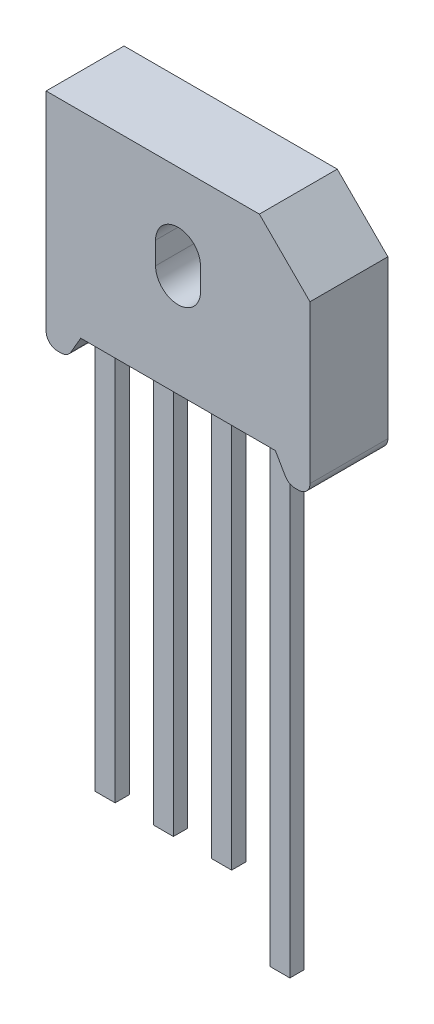
ISO-10303-21;
HEADER;
FILE_DESCRIPTION(('STEP AP214'),'2;1');
FILE_NAME('part.step','',(''),(''),'','','');
FILE_SCHEMA(('AUTOMOTIVE_DESIGN { 1 0 10303 214 1 1 1 1 }'));
ENDSEC;
DATA;
#1=APPLICATION_CONTEXT('core data for automotive mechanical design processes');
#2=APPLICATION_PROTOCOL_DEFINITION('international standard','automotive_design',2000,#1);
#3=PRODUCT_CONTEXT('',#1,'mechanical');
#4=PRODUCT('Part','Part','',(#3));
#5=PRODUCT_RELATED_PRODUCT_CATEGORY('part','',(#4));
#6=PRODUCT_DEFINITION_FORMATION('','',#4);
#7=PRODUCT_DEFINITION_CONTEXT('part definition',#1,'design');
#8=PRODUCT_DEFINITION('design','',#6,#7);
#9=PRODUCT_DEFINITION_SHAPE('','',#8);
#10=(LENGTH_UNIT() NAMED_UNIT(*) SI_UNIT(.MILLI.,.METRE.));
#11=(NAMED_UNIT(*) PLANE_ANGLE_UNIT() SI_UNIT($,.RADIAN.));
#12=(NAMED_UNIT(*) SI_UNIT($,.STERADIAN.) SOLID_ANGLE_UNIT());
#13=UNCERTAINTY_MEASURE_WITH_UNIT(LENGTH_MEASURE(1.E-05),#10,'distance_accuracy_value','');
#14=(GEOMETRIC_REPRESENTATION_CONTEXT(3) GLOBAL_UNCERTAINTY_ASSIGNED_CONTEXT((#13)) GLOBAL_UNIT_ASSIGNED_CONTEXT((#10,
#11,#12)) REPRESENTATION_CONTEXT('',''));
#15=CARTESIAN_POINT('',(0.,0.,0.));
#16=DIRECTION('',(0.,0.,1.));
#17=DIRECTION('',(1.,0.,0.));
#18=AXIS2_PLACEMENT_3D('',#15,#16,#17);
#19=CARTESIAN_POINT('',(0.,-2.89906260184823,3.425));
#20=DIRECTION('',(0.,1.,0.));
#21=DIRECTION('',(-1.,0.,0.));
#22=AXIS2_PLACEMENT_3D('',#19,#20,#21);
#23=PLANE('',#22);
#24=DIRECTION('',(-1.,0.,0.));
#25=VECTOR('',#24,1.);
#26=CARTESIAN_POINT('',(1.68627106179795,-2.89906260184823,2.15));
#27=LINE('',#26,#25);
#28=CARTESIAN_POINT('',(3.43627106179795,-2.89906260184823,2.15));
#29=VERTEX_POINT('',#28);
#30=CARTESIAN_POINT('',(1.68627106179795,-2.89906260184823,2.15));
#31=VERTEX_POINT('',#30);
#32=EDGE_CURVE('E315',#29,#31,#27,.T.);
#33=ORIENTED_EDGE('',*,*,#32,.F.);
#34=DIRECTION('',(0.,0.,1.));
#35=VECTOR('',#34,1.);
#36=CARTESIAN_POINT('',(3.43627106179795,-2.89906260184823,0.900000000000001));
#37=LINE('',#36,#35);
#38=CARTESIAN_POINT('',(3.43627106179795,-2.89906260184823,0.900000000000001));
#39=VERTEX_POINT('',#38);
#40=EDGE_CURVE('E321',#39,#29,#37,.T.);
#41=ORIENTED_EDGE('',*,*,#40,.F.);
#42=DIRECTION('',(1.,0.,0.));
#43=VECTOR('',#42,1.);
#44=CARTESIAN_POINT('',(1.68627106179795,-2.89906260184823,0.900000000000001));
#45=LINE('',#44,#43);
#46=CARTESIAN_POINT('',(1.68627106179789,-2.89906260184823,0.900000000000001));
#47=VERTEX_POINT('',#46);
#48=EDGE_CURVE('E336',#47,#39,#45,.T.);
#49=ORIENTED_EDGE('',*,*,#48,.F.);
#50=DIRECTION('',(0.,0.,-1.));
#51=VECTOR('',#50,1.);
#52=CARTESIAN_POINT('',(1.68627106179795,-2.89906260184823,0.900000000000001));
#53=LINE('',#52,#51);
#54=EDGE_CURVE('E71',#31,#47,#53,.T.);
#55=ORIENTED_EDGE('',*,*,#54,.F.);
#56=EDGE_LOOP('',(#33,#41,#49,#55));
#57=FACE_BOUND('',#56,.T.);
#58=DIRECTION('',(-1.,0.,0.));
#59=VECTOR('',#58,1.);
#60=CARTESIAN_POINT('',(-3.43627106179791,-2.89906260184822,2.15));
#61=LINE('',#60,#59);
#62=CARTESIAN_POINT('',(-1.68627106179791,-2.89906260184822,2.15));
#63=VERTEX_POINT('',#62);
#64=CARTESIAN_POINT('',(-3.43627106179791,-2.89906260184822,2.15));
#65=VERTEX_POINT('',#64);
#66=EDGE_CURVE('E357',#63,#65,#61,.T.);
#67=ORIENTED_EDGE('',*,*,#66,.F.);
#68=DIRECTION('',(0.,0.,1.));
#69=VECTOR('',#68,1.);
#70=CARTESIAN_POINT('',(-1.68627106179791,-2.89906260184822,0.900000000000001));
#71=LINE('',#70,#69);
#72=CARTESIAN_POINT('',(-1.68627106179791,-2.89906260184822,0.900000000000001));
#73=VERTEX_POINT('',#72);
#74=EDGE_CURVE('E363',#73,#63,#71,.T.);
#75=ORIENTED_EDGE('',*,*,#74,.F.);
#76=DIRECTION('',(1.,0.,0.));
#77=VECTOR('',#76,1.);
#78=CARTESIAN_POINT('',(-3.43627106179791,-2.89906260184822,0.900000000000001));
#79=LINE('',#78,#77);
#80=CARTESIAN_POINT('',(-3.43627106179797,-2.89906260184822,0.900000000000001));
#81=VERTEX_POINT('',#80);
#82=EDGE_CURVE('E379',#81,#73,#79,.T.);
#83=ORIENTED_EDGE('',*,*,#82,.F.);
#84=DIRECTION('',(0.,0.,-1.));
#85=VECTOR('',#84,1.);
#86=CARTESIAN_POINT('',(-3.43627106179791,-2.89906260184822,0.900000000000001));
#87=LINE('',#86,#85);
#88=EDGE_CURVE('E375',#65,#81,#87,.T.);
#89=ORIENTED_EDGE('',*,*,#88,.F.);
#90=EDGE_LOOP('',(#67,#75,#83,#89));
#91=FACE_BOUND('',#90,.T.);
#92=DIRECTION('',(-1.,0.,0.));
#93=VECTOR('',#92,1.);
#94=CARTESIAN_POINT('',(6.8088131853938,-2.89906260184824,2.15));
#95=LINE('',#94,#93);
#96=CARTESIAN_POINT('',(8.5588131853938,-2.89906260184824,2.15));
#97=VERTEX_POINT('',#96);
#98=CARTESIAN_POINT('',(6.8088131853938,-2.89906260184824,2.15));
#99=VERTEX_POINT('',#98);
#100=EDGE_CURVE('E296',#97,#99,#95,.T.);
#101=ORIENTED_EDGE('',*,*,#100,.F.);
#102=DIRECTION('',(0.,0.,-1.));
#103=VECTOR('',#102,1.);
#104=CARTESIAN_POINT('',(8.5588131853938,-2.89906260184824,3.425));
#105=LINE('',#104,#103);
#106=CARTESIAN_POINT('',(8.5588131853938,-2.89906260184824,3.425));
#107=VERTEX_POINT('',#106);
#108=EDGE_CURVE('E590',#107,#97,#105,.T.);
#109=ORIENTED_EDGE('',*,*,#108,.F.);
#110=DIRECTION('',(1.,0.,0.));
#111=VECTOR('',#110,1.);
#112=CARTESIAN_POINT('',(0.,-2.89906260184823,3.425));
#113=LINE('',#112,#111);
#114=CARTESIAN_POINT('',(-8.55881318539377,-2.89906260184821,3.425));
#115=VERTEX_POINT('',#114);
#116=EDGE_CURVE('E480',#115,#107,#113,.T.);
#117=ORIENTED_EDGE('',*,*,#116,.F.);
#118=DIRECTION('',(0.,0.,-1.));
#119=VECTOR('',#118,1.);
#120=CARTESIAN_POINT('',(-8.55881318539377,-2.89906260184821,3.425));
#121=LINE('',#120,#119);
#122=CARTESIAN_POINT('',(-8.55881318539377,-2.89906260184821,2.15));
#123=VERTEX_POINT('',#122);
#124=EDGE_CURVE('E595',#115,#123,#121,.T.);
#125=ORIENTED_EDGE('',*,*,#124,.T.);
#126=DIRECTION('',(-1.,0.,0.));
#127=VECTOR('',#126,1.);
#128=CARTESIAN_POINT('',(-8.55881318539377,-2.89906260184821,2.15));
#129=LINE('',#128,#127);
#130=CARTESIAN_POINT('',(-6.80881318539377,-2.89906260184822,2.15));
#131=VERTEX_POINT('',#130);
#132=EDGE_CURVE('E420',#131,#123,#129,.T.);
#133=ORIENTED_EDGE('',*,*,#132,.F.);
#134=DIRECTION('',(0.,0.,1.));
#135=VECTOR('',#134,1.);
#136=CARTESIAN_POINT('',(-6.80881318539377,-2.89906260184822,0.900000000000001));
#137=LINE('',#136,#135);
#138=CARTESIAN_POINT('',(-6.80881318539377,-2.89906260184822,0.900000000000001));
#139=VERTEX_POINT('',#138);
#140=EDGE_CURVE('E401',#139,#131,#137,.T.);
#141=ORIENTED_EDGE('',*,*,#140,.F.);
#142=DIRECTION('',(1.,0.,0.));
#143=VECTOR('',#142,1.);
#144=CARTESIAN_POINT('',(-8.55881318539377,-2.89906260184821,0.900000000000001));
#145=LINE('',#144,#143);
#146=CARTESIAN_POINT('',(-8.55881318539377,-2.89906260184821,0.900000000000002));
#147=VERTEX_POINT('',#146);
#148=EDGE_CURVE('E407',#147,#139,#145,.T.);
#149=ORIENTED_EDGE('',*,*,#148,.F.);
#150=CARTESIAN_POINT('',(-8.55881318539377,-2.89906260184821,-3.425));
#151=VERTEX_POINT('',#150);
#152=EDGE_CURVE('E594',#147,#151,#121,.T.);
#153=ORIENTED_EDGE('',*,*,#152,.T.);
#154=DIRECTION('',(1.,0.,0.));
#155=VECTOR('',#154,1.);
#156=CARTESIAN_POINT('',(0.,-2.89906260184823,-3.425));
#157=LINE('',#156,#155);
#158=CARTESIAN_POINT('',(8.5588131853938,-2.89906260184824,-3.425));
#159=VERTEX_POINT('',#158);
#160=EDGE_CURVE('E543',#151,#159,#157,.T.);
#161=ORIENTED_EDGE('',*,*,#160,.T.);
#162=CARTESIAN_POINT('',(8.5588131853938,-2.89906260184824,0.900000000000002));
#163=VERTEX_POINT('',#162);
#164=EDGE_CURVE('E589',#163,#159,#105,.T.);
#165=ORIENTED_EDGE('',*,*,#164,.F.);
#166=DIRECTION('',(1.,0.,0.));
#167=VECTOR('',#166,1.);
#168=CARTESIAN_POINT('',(6.8088131853938,-2.89906260184824,0.900000000000001));
#169=LINE('',#168,#167);
#170=CARTESIAN_POINT('',(6.8088131853938,-2.89906260184824,0.900000000000001));
#171=VERTEX_POINT('',#170);
#172=EDGE_CURVE('E302',#171,#163,#169,.T.);
#173=ORIENTED_EDGE('',*,*,#172,.F.);
#174=DIRECTION('',(0.,0.,-1.));
#175=VECTOR('',#174,1.);
#176=CARTESIAN_POINT('',(6.8088131853938,-2.89906260184824,0.900000000000001));
#177=LINE('',#176,#175);
#178=EDGE_CURVE('E299',#99,#171,#177,.T.);
#179=ORIENTED_EDGE('',*,*,#178,.F.);
#180=EDGE_LOOP('',(#101,#109,#117,#125,#133,#141,#149,#153,#161,#165,#173,#179));
#181=FACE_BOUND('',#180,.T.);
#182=ADVANCED_FACE('F45',(#57,#91,#181),#23,.F.);
#183=CARTESIAN_POINT('',(0.,5.90391050292713,3.425));
#184=DIRECTION('',(0.,0.,-1.));
#185=DIRECTION('',(-1.,0.,0.));
#186=AXIS2_PLACEMENT_3D('',#183,#184,#185);
#187=CYLINDRICAL_SURFACE('',#186,1.975);
#188=CARTESIAN_POINT('',(0.,5.90391050292713,-3.425));
#189=DIRECTION('',(0.,0.,1.));
#190=DIRECTION('',(1.,0.,0.));
#191=AXIS2_PLACEMENT_3D('',#188,#189,#190);
#192=CIRCLE('',#191,1.975);
#193=CARTESIAN_POINT('',(-1.975,5.90391050292713,-3.425));
#194=VERTEX_POINT('',#193);
#195=CARTESIAN_POINT('',(1.97500000000001,5.90391050292713,-3.425));
#196=VERTEX_POINT('',#195);
#197=EDGE_CURVE('E559',#194,#196,#192,.T.);
#198=ORIENTED_EDGE('',*,*,#197,.F.);
#199=DIRECTION('',(0.,0.,-1.));
#200=VECTOR('',#199,1.);
#201=CARTESIAN_POINT('',(-1.975,5.90391050292713,3.425));
#202=LINE('',#201,#200);
#203=CARTESIAN_POINT('',(-1.975,5.90391050292713,3.425));
#204=VERTEX_POINT('',#203);
#205=EDGE_CURVE('E11',#204,#194,#202,.T.);
#206=ORIENTED_EDGE('',*,*,#205,.F.);
#207=CARTESIAN_POINT('',(0.,5.90391050292713,3.425));
#208=DIRECTION('',(0.,0.,1.));
#209=DIRECTION('',(1.,0.,0.));
#210=AXIS2_PLACEMENT_3D('',#207,#208,#209);
#211=CIRCLE('',#210,1.975);
#212=CARTESIAN_POINT('',(1.97500000000001,5.90391050292713,3.425));
#213=VERTEX_POINT('',#212);
#214=EDGE_CURVE('E494',#204,#213,#211,.T.);
#215=ORIENTED_EDGE('',*,*,#214,.T.);
#216=DIRECTION('',(0.,0.,-1.));
#217=VECTOR('',#216,1.);
#218=CARTESIAN_POINT('',(1.97500000000001,5.90391050292713,3.425));
#219=LINE('',#218,#217);
#220=EDGE_CURVE('E574',#213,#196,#219,.T.);
#221=ORIENTED_EDGE('',*,*,#220,.T.);
#222=EDGE_LOOP('',(#198,#206,#215,#221));
#223=FACE_BOUND('',#222,.T.);
#224=ADVANCED_FACE('F718',(#223),#187,.F.);
#225=CARTESIAN_POINT('',(-1.975,0.,3.425));
#226=DIRECTION('',(1.,0.,0.));
#227=DIRECTION('',(0.,1.,0.));
#228=AXIS2_PLACEMENT_3D('',#225,#226,#227);
#229=PLANE('',#228);
#230=DIRECTION('',(0.,-1.,0.));
#231=VECTOR('',#230,1.);
#232=CARTESIAN_POINT('',(-1.975,0.,-3.425));
#233=LINE('',#232,#231);
#234=CARTESIAN_POINT('',(-1.975,7.85391050292713,-3.425));
#235=VERTEX_POINT('',#234);
#236=EDGE_CURVE('E563',#235,#194,#233,.T.);
#237=ORIENTED_EDGE('',*,*,#236,.F.);
#238=DIRECTION('',(0.,0.,-1.));
#239=VECTOR('',#238,1.);
#240=CARTESIAN_POINT('',(-1.975,7.85391050292713,3.425));
#241=LINE('',#240,#239);
#242=CARTESIAN_POINT('',(-1.975,7.85391050292713,3.425));
#243=VERTEX_POINT('',#242);
#244=EDGE_CURVE('E55',#243,#235,#241,.T.);
#245=ORIENTED_EDGE('',*,*,#244,.F.);
#246=DIRECTION('',(0.,-1.,0.));
#247=VECTOR('',#246,1.);
#248=CARTESIAN_POINT('',(-1.975,0.,3.425));
#249=LINE('',#248,#247);
#250=EDGE_CURVE('E498',#243,#204,#249,.T.);
#251=ORIENTED_EDGE('',*,*,#250,.T.);
#252=ORIENTED_EDGE('',*,*,#205,.T.);
#253=EDGE_LOOP('',(#237,#245,#251,#252));
#254=FACE_BOUND('',#253,.T.);
#255=ADVANCED_FACE('F723',(#254),#229,.T.);
#256=CARTESIAN_POINT('',(0.,7.85391050292713,3.425));
#257=DIRECTION('',(0.,0.,-1.));
#258=DIRECTION('',(-1.,0.,0.));
#259=AXIS2_PLACEMENT_3D('',#256,#257,#258);
#260=CYLINDRICAL_SURFACE('',#259,1.975);
#261=CARTESIAN_POINT('',(0.,7.85391050292713,-3.425));
#262=DIRECTION('',(0.,0.,1.));
#263=DIRECTION('',(1.,0.,0.));
#264=AXIS2_PLACEMENT_3D('',#261,#262,#263);
#265=CIRCLE('',#264,1.975);
#266=CARTESIAN_POINT('',(1.97500000000001,7.85391050292713,-3.425));
#267=VERTEX_POINT('',#266);
#268=EDGE_CURVE('E567',#267,#235,#265,.T.);
#269=ORIENTED_EDGE('',*,*,#268,.F.);
#270=DIRECTION('',(0.,0.,-1.));
#271=VECTOR('',#270,1.);
#272=CARTESIAN_POINT('',(1.97500000000001,7.85391050292713,3.425));
#273=LINE('',#272,#271);
#274=CARTESIAN_POINT('',(1.97500000000001,7.85391050292713,3.425));
#275=VERTEX_POINT('',#274);
#276=EDGE_CURVE('E576',#275,#267,#273,.T.);
#277=ORIENTED_EDGE('',*,*,#276,.F.);
#278=CARTESIAN_POINT('',(0.,7.85391050292713,3.425));
#279=DIRECTION('',(0.,0.,1.));
#280=DIRECTION('',(1.,0.,0.));
#281=AXIS2_PLACEMENT_3D('',#278,#279,#280);
#282=CIRCLE('',#281,1.975);
#283=EDGE_CURVE('E502',#275,#243,#282,.T.);
#284=ORIENTED_EDGE('',*,*,#283,.T.);
#285=ORIENTED_EDGE('',*,*,#244,.T.);
#286=EDGE_LOOP('',(#269,#277,#284,#285));
#287=FACE_BOUND('',#286,.T.);
#288=ADVANCED_FACE('F747',(#287),#260,.F.);
#289=CARTESIAN_POINT('',(10.6,-3.89608949707287,3.425));
#290=DIRECTION('',(0.,0.,-1.));
#291=DIRECTION('',(-1.,0.,0.));
#292=AXIS2_PLACEMENT_3D('',#289,#290,#291);
#293=CYLINDRICAL_SURFACE('',#292,1.);
#294=CARTESIAN_POINT('',(10.6,-3.89608949707287,-3.425));
#295=DIRECTION('',(0.,0.,1.));
#296=DIRECTION('',(1.,0.,0.));
#297=AXIS2_PLACEMENT_3D('',#294,#295,#296);
#298=CIRCLE('',#297,1.);
#299=CARTESIAN_POINT('',(11.6,-3.89608949707286,-3.425));
#300=VERTEX_POINT('',#299);
#301=CARTESIAN_POINT('',(10.6,-4.89608949707287,-3.425));
#302=VERTEX_POINT('',#301);
#303=EDGE_CURVE('E446',#300,#302,#298,.F.);
#304=ORIENTED_EDGE('',*,*,#303,.F.);
#305=DIRECTION('',(0.,0.,-1.));
#306=VECTOR('',#305,1.);
#307=CARTESIAN_POINT('',(11.6,-3.89608949707286,3.425));
#308=LINE('',#307,#306);
#309=CARTESIAN_POINT('',(11.6,-3.89608949707286,3.425));
#310=VERTEX_POINT('',#309);
#311=EDGE_CURVE('E49',#310,#300,#308,.T.);
#312=ORIENTED_EDGE('',*,*,#311,.F.);
#313=CARTESIAN_POINT('',(10.6,-3.89608949707287,3.425));
#314=DIRECTION('',(0.,0.,1.));
#315=DIRECTION('',(1.,0.,0.));
#316=AXIS2_PLACEMENT_3D('',#313,#314,#315);
#317=CIRCLE('',#316,1.);
#318=CARTESIAN_POINT('',(10.6,-4.89608949707287,3.425));
#319=VERTEX_POINT('',#318);
#320=EDGE_CURVE('E447',#310,#319,#317,.F.);
#321=ORIENTED_EDGE('',*,*,#320,.T.);
#322=DIRECTION('',(0.,0.,-1.));
#323=VECTOR('',#322,1.);
#324=CARTESIAN_POINT('',(10.6,-4.89608949707287,3.425));
#325=LINE('',#324,#323);
#326=EDGE_CURVE('E509',#319,#302,#325,.T.);
#327=ORIENTED_EDGE('',*,*,#326,.T.);
#328=EDGE_LOOP('',(#304,#312,#321,#327));
#329=FACE_BOUND('',#328,.T.);
#330=ADVANCED_FACE('F47',(#329),#293,.T.);
#331=CARTESIAN_POINT('',(11.6,0.,3.425));
#332=DIRECTION('',(1.,0.,0.));
#333=DIRECTION('',(0.,0.,-1.));
#334=AXIS2_PLACEMENT_3D('',#331,#332,#333);
#335=PLANE('',#334);
#336=DIRECTION('',(0.,-1.,0.));
#337=VECTOR('',#336,1.);
#338=CARTESIAN_POINT('',(11.6,0.,-3.425));
#339=LINE('',#338,#337);
#340=CARTESIAN_POINT('',(11.6,9.95391050292714,-3.425));
#341=VERTEX_POINT('',#340);
#342=EDGE_CURVE('E513',#341,#300,#339,.T.);
#343=ORIENTED_EDGE('',*,*,#342,.F.);
#344=DIRECTION('',(0.,0.,-1.));
#345=VECTOR('',#344,1.);
#346=CARTESIAN_POINT('',(11.6,9.95391050292714,3.425));
#347=LINE('',#346,#345);
#348=CARTESIAN_POINT('',(11.6,9.95391050292714,3.425));
#349=VERTEX_POINT('',#348);
#350=EDGE_CURVE('E618',#349,#341,#347,.T.);
#351=ORIENTED_EDGE('',*,*,#350,.F.);
#352=DIRECTION('',(0.,-1.,0.));
#353=VECTOR('',#352,1.);
#354=CARTESIAN_POINT('',(11.6,0.,3.425));
#355=LINE('',#354,#353);
#356=EDGE_CURVE('E451',#349,#310,#355,.T.);
#357=ORIENTED_EDGE('',*,*,#356,.T.);
#358=ORIENTED_EDGE('',*,*,#311,.T.);
#359=EDGE_LOOP('',(#343,#351,#357,#358));
#360=FACE_BOUND('',#359,.T.);
#361=ADVANCED_FACE('F628',(#360),#335,.T.);
#362=CARTESIAN_POINT('',(10.7769552514636,10.7769552514636,3.425));
#363=DIRECTION('',(0.707106781186546,0.707106781186549,0.));
#364=DIRECTION('',(-0.707106781186549,0.707106781186546,0.));
#365=AXIS2_PLACEMENT_3D('',#362,#363,#364);
#366=PLANE('',#365);
#367=DIRECTION('',(0.707106781186549,-0.707106781186546,0.));
#368=VECTOR('',#367,1.);
#369=CARTESIAN_POINT('',(10.7769552514636,10.7769552514636,-3.425));
#370=LINE('',#369,#368);
#371=CARTESIAN_POINT('',(7.15,14.4039105029271,-3.425));
#372=VERTEX_POINT('',#371);
#373=EDGE_CURVE('E517',#372,#341,#370,.T.);
#374=ORIENTED_EDGE('',*,*,#373,.F.);
#375=DIRECTION('',(0.,0.,-1.));
#376=VECTOR('',#375,1.);
#377=CARTESIAN_POINT('',(7.15,14.4039105029271,3.425));
#378=LINE('',#377,#376);
#379=CARTESIAN_POINT('',(7.15,14.4039105029271,3.425));
#380=VERTEX_POINT('',#379);
#381=EDGE_CURVE('E616',#380,#372,#378,.T.);
#382=ORIENTED_EDGE('',*,*,#381,.F.);
#383=DIRECTION('',(0.707106781186549,-0.707106781186546,0.));
#384=VECTOR('',#383,1.);
#385=CARTESIAN_POINT('',(10.7769552514636,10.7769552514636,3.425));
#386=LINE('',#385,#384);
#387=EDGE_CURVE('E456',#380,#349,#386,.T.);
#388=ORIENTED_EDGE('',*,*,#387,.T.);
#389=ORIENTED_EDGE('',*,*,#350,.T.);
#390=EDGE_LOOP('',(#374,#382,#388,#389));
#391=FACE_BOUND('',#390,.T.);
#392=ADVANCED_FACE('F638',(#391),#366,.T.);
#393=CARTESIAN_POINT('',(0.,14.4039105029271,3.425));
#394=DIRECTION('',(0.,1.,0.));
#395=DIRECTION('',(-1.,0.,0.));
#396=AXIS2_PLACEMENT_3D('',#393,#394,#395);
#397=PLANE('',#396);
#398=DIRECTION('',(1.,0.,0.));
#399=VECTOR('',#398,1.);
#400=CARTESIAN_POINT('',(0.,14.4039105029271,-3.425));
#401=LINE('',#400,#399);
#402=CARTESIAN_POINT('',(-11.6,14.4039105029271,-3.425));
#403=VERTEX_POINT('',#402);
#404=EDGE_CURVE('E521',#403,#372,#401,.T.);
#405=ORIENTED_EDGE('',*,*,#404,.F.);
#406=DIRECTION('',(0.,0.,-1.));
#407=VECTOR('',#406,1.);
#408=CARTESIAN_POINT('',(-11.6,14.4039105029271,3.425));
#409=LINE('',#408,#407);
#410=CARTESIAN_POINT('',(-11.6,14.4039105029271,3.425));
#411=VERTEX_POINT('',#410);
#412=EDGE_CURVE('E613',#411,#403,#409,.T.);
#413=ORIENTED_EDGE('',*,*,#412,.F.);
#414=DIRECTION('',(1.,0.,0.));
#415=VECTOR('',#414,1.);
#416=CARTESIAN_POINT('',(0.,14.4039105029271,3.425));
#417=LINE('',#416,#415);
#418=EDGE_CURVE('E460',#411,#380,#417,.T.);
#419=ORIENTED_EDGE('',*,*,#418,.T.);
#420=ORIENTED_EDGE('',*,*,#381,.T.);
#421=EDGE_LOOP('',(#405,#413,#419,#420));
#422=FACE_BOUND('',#421,.T.);
#423=ADVANCED_FACE('F645',(#422),#397,.T.);
#424=CARTESIAN_POINT('',(-11.6,0.,3.425));
#425=DIRECTION('',(1.,0.,0.));
#426=DIRECTION('',(0.,0.,-1.));
#427=AXIS2_PLACEMENT_3D('',#424,#425,#426);
#428=PLANE('',#427);
#429=DIRECTION('',(0.,-1.,0.));
#430=VECTOR('',#429,1.);
#431=CARTESIAN_POINT('',(-11.6,0.,-3.425));
#432=LINE('',#431,#430);
#433=CARTESIAN_POINT('',(-11.6,-3.89608949707287,-3.425));
#434=VERTEX_POINT('',#433);
#435=EDGE_CURVE('E525',#403,#434,#432,.T.);
#436=ORIENTED_EDGE('',*,*,#435,.T.);
#437=DIRECTION('',(0.,0.,-1.));
#438=VECTOR('',#437,1.);
#439=CARTESIAN_POINT('',(-11.6,-3.89608949707287,3.425));
#440=LINE('',#439,#438);
#441=CARTESIAN_POINT('',(-11.6,-3.89608949707287,3.425));
#442=VERTEX_POINT('',#441);
#443=EDGE_CURVE('E609',#442,#434,#440,.T.);
#444=ORIENTED_EDGE('',*,*,#443,.F.);
#445=DIRECTION('',(0.,-1.,0.));
#446=VECTOR('',#445,1.);
#447=CARTESIAN_POINT('',(-11.6,0.,3.425));
#448=LINE('',#447,#446);
#449=EDGE_CURVE('E464',#411,#442,#448,.T.);
#450=ORIENTED_EDGE('',*,*,#449,.F.);
#451=ORIENTED_EDGE('',*,*,#412,.T.);
#452=EDGE_LOOP('',(#436,#444,#450,#451));
#453=FACE_BOUND('',#452,.T.);
#454=ADVANCED_FACE('F649',(#453),#428,.F.);
#455=CARTESIAN_POINT('',(-10.6,-3.89608949707287,3.425));
#456=DIRECTION('',(0.,0.,-1.));
#457=DIRECTION('',(-1.,0.,0.));
#458=AXIS2_PLACEMENT_3D('',#455,#456,#457);
#459=CYLINDRICAL_SURFACE('',#458,1.);
#460=CARTESIAN_POINT('',(-10.6,-3.89608949707287,-3.425));
#461=DIRECTION('',(0.,0.,1.));
#462=DIRECTION('',(1.,0.,0.));
#463=AXIS2_PLACEMENT_3D('',#460,#461,#462);
#464=CIRCLE('',#463,1.);
#465=CARTESIAN_POINT('',(-10.6,-4.89608949707287,-3.425));
#466=VERTEX_POINT('',#465);
#467=EDGE_CURVE('E528',#434,#466,#464,.T.);
#468=ORIENTED_EDGE('',*,*,#467,.T.);
#469=DIRECTION('',(0.,0.,-1.));
#470=VECTOR('',#469,1.);
#471=CARTESIAN_POINT('',(-10.6,-4.89608949707287,3.425));
#472=LINE('',#471,#470);
#473=CARTESIAN_POINT('',(-10.6,-4.89608949707287,3.425));
#474=VERTEX_POINT('',#473);
#475=EDGE_CURVE('E605',#474,#466,#472,.T.);
#476=ORIENTED_EDGE('',*,*,#475,.F.);
#477=CARTESIAN_POINT('',(-10.6,-3.89608949707287,3.425));
#478=DIRECTION('',(0.,0.,1.));
#479=DIRECTION('',(1.,0.,0.));
#480=AXIS2_PLACEMENT_3D('',#477,#478,#479);
#481=CIRCLE('',#480,1.);
#482=EDGE_CURVE('E467',#442,#474,#481,.T.);
#483=ORIENTED_EDGE('',*,*,#482,.F.);
#484=ORIENTED_EDGE('',*,*,#443,.T.);
#485=EDGE_LOOP('',(#468,#476,#483,#484));
#486=FACE_BOUND('',#485,.T.);
#487=ADVANCED_FACE('F656',(#486),#459,.T.);
#488=CARTESIAN_POINT('',(0.,-4.89608949707287,3.425));
#489=DIRECTION('',(0.,1.,0.));
#490=DIRECTION('',(0.,0.,1.));
#491=AXIS2_PLACEMENT_3D('',#488,#489,#490);
#492=PLANE('',#491);
#493=DIRECTION('',(1.,0.,0.));
#494=VECTOR('',#493,1.);
#495=CARTESIAN_POINT('',(0.,-4.89608949707287,-3.425));
#496=LINE('',#495,#494);
#497=CARTESIAN_POINT('',(-10.2891474701203,-4.89608949707287,-3.425));
#498=VERTEX_POINT('',#497);
#499=EDGE_CURVE('E531',#466,#498,#496,.T.);
#500=ORIENTED_EDGE('',*,*,#499,.T.);
#501=DIRECTION('',(0.,0.,-1.));
#502=VECTOR('',#501,1.);
#503=CARTESIAN_POINT('',(-10.2891474701203,-4.89608949707287,3.425));
#504=LINE('',#503,#502);
#505=CARTESIAN_POINT('',(-10.2891474701203,-4.89608949707287,3.425));
#506=VERTEX_POINT('',#505);
#507=EDGE_CURVE('E602',#506,#498,#504,.T.);
#508=ORIENTED_EDGE('',*,*,#507,.F.);
#509=DIRECTION('',(1.,0.,0.));
#510=VECTOR('',#509,1.);
#511=CARTESIAN_POINT('',(0.,-4.89608949707287,3.425));
#512=LINE('',#511,#510);
#513=EDGE_CURVE('E470',#474,#506,#512,.T.);
#514=ORIENTED_EDGE('',*,*,#513,.F.);
#515=ORIENTED_EDGE('',*,*,#475,.T.);
#516=EDGE_LOOP('',(#500,#508,#514,#515));
#517=FACE_BOUND('',#516,.T.);
#518=ADVANCED_FACE('F660',(#517),#492,.F.);
#519=CARTESIAN_POINT('',(-10.2891474701203,-3.89608949707287,3.425));
#520=DIRECTION('',(0.,0.,-1.));
#521=DIRECTION('',(-1.,0.,0.));
#522=AXIS2_PLACEMENT_3D('',#519,#520,#521);
#523=CYLINDRICAL_SURFACE('',#522,1.);
#524=CARTESIAN_POINT('',(-10.2891474701203,-3.89608949707287,-3.425));
#525=DIRECTION('',(0.,0.,1.));
#526=DIRECTION('',(1.,0.,0.));
#527=AXIS2_PLACEMENT_3D('',#524,#525,#526);
#528=CIRCLE('',#527,1.);
#529=CARTESIAN_POINT('',(-9.42312206633583,-4.39608949707287,-3.425));
#530=VERTEX_POINT('',#529);
#531=EDGE_CURVE('E535',#530,#498,#528,.F.);
#532=ORIENTED_EDGE('',*,*,#531,.F.);
#533=DIRECTION('',(0.,0.,-1.));
#534=VECTOR('',#533,1.);
#535=CARTESIAN_POINT('',(-9.42312206633583,-4.39608949707287,3.425));
#536=LINE('',#535,#534);
#537=CARTESIAN_POINT('',(-9.42312206633583,-4.39608949707287,3.425));
#538=VERTEX_POINT('',#537);
#539=EDGE_CURVE('E599',#538,#530,#536,.T.);
#540=ORIENTED_EDGE('',*,*,#539,.F.);
#541=CARTESIAN_POINT('',(-10.2891474701203,-3.89608949707287,3.425));
#542=DIRECTION('',(0.,0.,1.));
#543=DIRECTION('',(1.,0.,0.));
#544=AXIS2_PLACEMENT_3D('',#541,#542,#543);
#545=CIRCLE('',#544,1.);
#546=EDGE_CURVE('E473',#538,#506,#545,.F.);
#547=ORIENTED_EDGE('',*,*,#546,.T.);
#548=ORIENTED_EDGE('',*,*,#507,.T.);
#549=EDGE_LOOP('',(#532,#540,#547,#548));
#550=FACE_BOUND('',#549,.T.);
#551=ADVANCED_FACE('F663',(#550),#523,.T.);
#552=CARTESIAN_POINT('',(-5.16377895886437,2.98130917193605,3.425));
#553=DIRECTION('',(-0.86602540378444,0.499999999999998,0.));
#554=DIRECTION('',(-0.499999999999998,-0.86602540378444,0.));
#555=AXIS2_PLACEMENT_3D('',#552,#553,#554);
#556=PLANE('',#555);
#557=DIRECTION('',(0.499999999999998,0.86602540378444,0.));
#558=VECTOR('',#557,1.);
#559=CARTESIAN_POINT('',(-5.16377895886437,2.98130917193605,-3.425));
#560=LINE('',#559,#558);
#561=EDGE_CURVE('E539',#530,#151,#560,.T.);
#562=ORIENTED_EDGE('',*,*,#561,.T.);
#563=ORIENTED_EDGE('',*,*,#152,.F.);
#564=DIRECTION('',(0.,0.,-1.));
#565=VECTOR('',#564,1.);
#566=CARTESIAN_POINT('',(-8.55881318539377,-2.89906260184821,0.900000000000001));
#567=LINE('',#566,#565);
#568=EDGE_CURVE('E424',#123,#147,#567,.T.);
#569=ORIENTED_EDGE('',*,*,#568,.F.);
#570=ORIENTED_EDGE('',*,*,#124,.F.);
#571=DIRECTION('',(0.499999999999998,0.86602540378444,0.));
#572=VECTOR('',#571,1.);
#573=CARTESIAN_POINT('',(-5.16377895886437,2.98130917193605,3.425));
#574=LINE('',#573,#572);
#575=EDGE_CURVE('E477',#538,#115,#574,.T.);
#576=ORIENTED_EDGE('',*,*,#575,.F.);
#577=ORIENTED_EDGE('',*,*,#539,.T.);
#578=EDGE_LOOP('',(#562,#563,#569,#570,#576,#577));
#579=FACE_BOUND('',#578,.T.);
#580=ADVANCED_FACE('F670',(#579),#556,.F.);
#581=CARTESIAN_POINT('',(5.16377895886438,2.98130917193606,3.425));
#582=DIRECTION('',(-0.86602540378444,-0.499999999999998,0.));
#583=DIRECTION('',(0.499999999999998,-0.86602540378444,0.));
#584=AXIS2_PLACEMENT_3D('',#581,#582,#583);
#585=PLANE('',#584);
#586=DIRECTION('',(-0.499999999999998,0.86602540378444,0.));
#587=VECTOR('',#586,1.);
#588=CARTESIAN_POINT('',(5.16377895886438,2.98130917193606,-3.425));
#589=LINE('',#588,#587);
#590=CARTESIAN_POINT('',(9.42312206633584,-4.39608949707286,-3.425));
#591=VERTEX_POINT('',#590);
#592=EDGE_CURVE('E547',#591,#159,#589,.T.);
#593=ORIENTED_EDGE('',*,*,#592,.F.);
#594=DIRECTION('',(0.,0.,-1.));
#595=VECTOR('',#594,1.);
#596=CARTESIAN_POINT('',(9.42312206633584,-4.39608949707286,3.425));
#597=LINE('',#596,#595);
#598=CARTESIAN_POINT('',(9.42312206633584,-4.39608949707286,3.425));
#599=VERTEX_POINT('',#598);
#600=EDGE_CURVE('E586',#599,#591,#597,.T.);
#601=ORIENTED_EDGE('',*,*,#600,.F.);
#602=DIRECTION('',(-0.499999999999998,0.86602540378444,0.));
#603=VECTOR('',#602,1.);
#604=CARTESIAN_POINT('',(5.16377895886438,2.98130917193606,3.425));
#605=LINE('',#604,#603);
#606=EDGE_CURVE('E483',#599,#107,#605,.T.);
#607=ORIENTED_EDGE('',*,*,#606,.T.);
#608=ORIENTED_EDGE('',*,*,#108,.T.);
#609=DIRECTION('',(0.,0.,1.));
#610=VECTOR('',#609,1.);
#611=CARTESIAN_POINT('',(8.5588131853938,-2.89906260184824,0.900000000000001));
#612=LINE('',#611,#610);
#613=EDGE_CURVE('E266',#163,#97,#612,.T.);
#614=ORIENTED_EDGE('',*,*,#613,.F.);
#615=ORIENTED_EDGE('',*,*,#164,.T.);
#616=EDGE_LOOP('',(#593,#601,#607,#608,#614,#615));
#617=FACE_BOUND('',#616,.T.);
#618=ADVANCED_FACE('F676',(#617),#585,.T.);
#619=CARTESIAN_POINT('',(10.2891474701203,-3.89608949707287,3.425));
#620=DIRECTION('',(0.,0.,-1.));
#621=DIRECTION('',(-1.,0.,0.));
#622=AXIS2_PLACEMENT_3D('',#619,#620,#621);
#623=CYLINDRICAL_SURFACE('',#622,1.);
#624=CARTESIAN_POINT('',(10.2891474701203,-3.89608949707287,-3.425));
#625=DIRECTION('',(0.,0.,1.));
#626=DIRECTION('',(1.,0.,0.));
#627=AXIS2_PLACEMENT_3D('',#624,#625,#626);
#628=CIRCLE('',#627,1.);
#629=CARTESIAN_POINT('',(10.2891474701203,-4.89608949707287,-3.425));
#630=VERTEX_POINT('',#629);
#631=EDGE_CURVE('E551',#591,#630,#628,.T.);
#632=ORIENTED_EDGE('',*,*,#631,.T.);
#633=DIRECTION('',(0.,0.,-1.));
#634=VECTOR('',#633,1.);
#635=CARTESIAN_POINT('',(10.2891474701203,-4.89608949707287,3.425));
#636=LINE('',#635,#634);
#637=CARTESIAN_POINT('',(10.2891474701203,-4.89608949707287,3.425));
#638=VERTEX_POINT('',#637);
#639=EDGE_CURVE('E583',#638,#630,#636,.T.);
#640=ORIENTED_EDGE('',*,*,#639,.F.);
#641=CARTESIAN_POINT('',(10.2891474701203,-3.89608949707287,3.425));
#642=DIRECTION('',(0.,0.,1.));
#643=DIRECTION('',(1.,0.,0.));
#644=AXIS2_PLACEMENT_3D('',#641,#642,#643);
#645=CIRCLE('',#644,1.);
#646=EDGE_CURVE('E487',#599,#638,#645,.T.);
#647=ORIENTED_EDGE('',*,*,#646,.F.);
#648=ORIENTED_EDGE('',*,*,#600,.T.);
#649=EDGE_LOOP('',(#632,#640,#647,#648));
#650=FACE_BOUND('',#649,.T.);
#651=ADVANCED_FACE('F681',(#650),#623,.T.);
#652=CARTESIAN_POINT('',(0.,-4.89608949707287,3.425));
#653=DIRECTION('',(0.,-1.,0.));
#654=DIRECTION('',(0.,0.,-1.));
#655=AXIS2_PLACEMENT_3D('',#652,#653,#654);
#656=PLANE('',#655);
#657=DIRECTION('',(-1.,0.,0.));
#658=VECTOR('',#657,1.);
#659=CARTESIAN_POINT('',(0.,-4.89608949707287,-3.425));
#660=LINE('',#659,#658);
#661=EDGE_CURVE('E555',#302,#630,#660,.T.);
#662=ORIENTED_EDGE('',*,*,#661,.F.);
#663=ORIENTED_EDGE('',*,*,#326,.F.);
#664=DIRECTION('',(-1.,0.,0.));
#665=VECTOR('',#664,1.);
#666=CARTESIAN_POINT('',(0.,-4.89608949707287,3.425));
#667=LINE('',#666,#665);
#668=EDGE_CURVE('E490',#319,#638,#667,.T.);
#669=ORIENTED_EDGE('',*,*,#668,.T.);
#670=ORIENTED_EDGE('',*,*,#639,.T.);
#671=EDGE_LOOP('',(#662,#663,#669,#670));
#672=FACE_BOUND('',#671,.T.);
#673=ADVANCED_FACE('F684',(#672),#656,.T.);
#674=CARTESIAN_POINT('',(1.97500000000001,0.,3.425));
#675=DIRECTION('',(1.,0.,0.));
#676=DIRECTION('',(0.,1.,0.));
#677=AXIS2_PLACEMENT_3D('',#674,#675,#676);
#678=PLANE('',#677);
#679=DIRECTION('',(0.,-1.,0.));
#680=VECTOR('',#679,1.);
#681=CARTESIAN_POINT('',(1.97500000000001,0.,-3.425));
#682=LINE('',#681,#680);
#683=EDGE_CURVE('E452',#267,#196,#682,.T.);
#684=ORIENTED_EDGE('',*,*,#683,.T.);
#685=ORIENTED_EDGE('',*,*,#220,.F.);
#686=DIRECTION('',(0.,-1.,0.));
#687=VECTOR('',#686,1.);
#688=CARTESIAN_POINT('',(1.97500000000001,0.,3.425));
#689=LINE('',#688,#687);
#690=EDGE_CURVE('E506',#275,#213,#689,.T.);
#691=ORIENTED_EDGE('',*,*,#690,.F.);
#692=ORIENTED_EDGE('',*,*,#276,.T.);
#693=EDGE_LOOP('',(#684,#685,#691,#692));
#694=FACE_BOUND('',#693,.T.);
#695=ADVANCED_FACE('F760',(#694),#678,.F.);
#696=CARTESIAN_POINT('',(0.,0.,3.425));
#697=DIRECTION('',(0.,0.,1.));
#698=DIRECTION('',(1.,0.,0.));
#699=AXIS2_PLACEMENT_3D('',#696,#697,#698);
#700=PLANE('',#699);
#701=ORIENTED_EDGE('',*,*,#320,.F.);
#702=ORIENTED_EDGE('',*,*,#356,.F.);
#703=ORIENTED_EDGE('',*,*,#387,.F.);
#704=ORIENTED_EDGE('',*,*,#418,.F.);
#705=ORIENTED_EDGE('',*,*,#449,.T.);
#706=ORIENTED_EDGE('',*,*,#482,.T.);
#707=ORIENTED_EDGE('',*,*,#513,.T.);
#708=ORIENTED_EDGE('',*,*,#546,.F.);
#709=ORIENTED_EDGE('',*,*,#575,.T.);
#710=ORIENTED_EDGE('',*,*,#116,.T.);
#711=ORIENTED_EDGE('',*,*,#606,.F.);
#712=ORIENTED_EDGE('',*,*,#646,.T.);
#713=ORIENTED_EDGE('',*,*,#668,.F.);
#714=EDGE_LOOP('',(#701,#702,#703,#704,#705,#706,#707,#708,#709,#710,#711,#712,#713));
#715=FACE_BOUND('',#714,.T.);
#716=ORIENTED_EDGE('',*,*,#214,.F.);
#717=ORIENTED_EDGE('',*,*,#250,.F.);
#718=ORIENTED_EDGE('',*,*,#283,.F.);
#719=ORIENTED_EDGE('',*,*,#690,.T.);
#720=EDGE_LOOP('',(#716,#717,#718,#719));
#721=FACE_BOUND('',#720,.T.);
#722=ADVANCED_FACE('F643',(#715,#721),#700,.T.);
#723=CARTESIAN_POINT('',(0.,0.,-3.425));
#724=DIRECTION('',(0.,0.,1.));
#725=DIRECTION('',(1.,0.,0.));
#726=AXIS2_PLACEMENT_3D('',#723,#724,#725);
#727=PLANE('',#726);
#728=ORIENTED_EDGE('',*,*,#303,.T.);
#729=ORIENTED_EDGE('',*,*,#661,.T.);
#730=ORIENTED_EDGE('',*,*,#631,.F.);
#731=ORIENTED_EDGE('',*,*,#592,.T.);
#732=ORIENTED_EDGE('',*,*,#160,.F.);
#733=ORIENTED_EDGE('',*,*,#561,.F.);
#734=ORIENTED_EDGE('',*,*,#531,.T.);
#735=ORIENTED_EDGE('',*,*,#499,.F.);
#736=ORIENTED_EDGE('',*,*,#467,.F.);
#737=ORIENTED_EDGE('',*,*,#435,.F.);
#738=ORIENTED_EDGE('',*,*,#404,.T.);
#739=ORIENTED_EDGE('',*,*,#373,.T.);
#740=ORIENTED_EDGE('',*,*,#342,.T.);
#741=EDGE_LOOP('',(#728,#729,#730,#731,#732,#733,#734,#735,#736,#737,#738,#739,#740));
#742=FACE_BOUND('',#741,.T.);
#743=ORIENTED_EDGE('',*,*,#197,.T.);
#744=ORIENTED_EDGE('',*,*,#683,.F.);
#745=ORIENTED_EDGE('',*,*,#268,.T.);
#746=ORIENTED_EDGE('',*,*,#236,.T.);
#747=EDGE_LOOP('',(#743,#744,#745,#746));
#748=FACE_BOUND('',#747,.T.);
#749=ADVANCED_FACE('F634',(#742,#748),#727,.F.);
#750=CARTESIAN_POINT('',(-6.80881318539383,-38.0490626018482,0.900000000000001));
#751=DIRECTION('',(-1.,0.,0.));
#752=DIRECTION('',(0.,-1.,0.));
#753=AXIS2_PLACEMENT_3D('',#750,#751,#752);
#754=PLANE('',#753);
#755=ORIENTED_EDGE('',*,*,#140,.T.);
#756=DIRECTION('',(0.,1.,0.));
#757=VECTOR('',#756,1.);
#758=CARTESIAN_POINT('',(-6.80881318539383,-38.0490626018482,2.15));
#759=LINE('',#758,#757);
#760=CARTESIAN_POINT('',(-6.80881318539383,-38.0490626018482,2.15));
#761=VERTEX_POINT('',#760);
#762=EDGE_CURVE('E442',#761,#131,#759,.T.);
#763=ORIENTED_EDGE('',*,*,#762,.F.);
#764=DIRECTION('',(0.,0.,1.));
#765=VECTOR('',#764,1.);
#766=CARTESIAN_POINT('',(-6.80881318539383,-38.0490626018482,0.900000000000001));
#767=LINE('',#766,#765);
#768=CARTESIAN_POINT('',(-6.80881318539383,-38.0490626018482,0.900000000000001));
#769=VERTEX_POINT('',#768);
#770=EDGE_CURVE('E402',#769,#761,#767,.T.);
#771=ORIENTED_EDGE('',*,*,#770,.F.);
#772=DIRECTION('',(0.,1.,0.));
#773=VECTOR('',#772,1.);
#774=CARTESIAN_POINT('',(-6.80881318539383,-38.0490626018482,0.900000000000001));
#775=LINE('',#774,#773);
#776=EDGE_CURVE('E416',#769,#139,#775,.T.);
#777=ORIENTED_EDGE('',*,*,#776,.T.);
#778=EDGE_LOOP('',(#755,#763,#771,#777));
#779=FACE_BOUND('',#778,.T.);
#780=ADVANCED_FACE('F707',(#779),#754,.F.);
#781=CARTESIAN_POINT('',(-8.55881318539383,-38.0490626018482,2.15));
#782=DIRECTION('',(0.,0.,-1.));
#783=DIRECTION('',(-1.,0.,0.));
#784=AXIS2_PLACEMENT_3D('',#781,#782,#783);
#785=PLANE('',#784);
#786=ORIENTED_EDGE('',*,*,#132,.T.);
#787=DIRECTION('',(0.,1.,0.));
#788=VECTOR('',#787,1.);
#789=CARTESIAN_POINT('',(-8.55881318539383,-38.0490626018482,2.15));
#790=LINE('',#789,#788);
#791=CARTESIAN_POINT('',(-8.55881318539383,-38.0490626018482,2.15));
#792=VERTEX_POINT('',#791);
#793=EDGE_CURVE('E438',#792,#123,#790,.T.);
#794=ORIENTED_EDGE('',*,*,#793,.F.);
#795=DIRECTION('',(-1.,0.,0.));
#796=VECTOR('',#795,1.);
#797=CARTESIAN_POINT('',(-8.55881318539383,-38.0490626018482,2.15));
#798=LINE('',#797,#796);
#799=EDGE_CURVE('E406',#761,#792,#798,.T.);
#800=ORIENTED_EDGE('',*,*,#799,.F.);
#801=ORIENTED_EDGE('',*,*,#762,.T.);
#802=EDGE_LOOP('',(#786,#794,#800,#801));
#803=FACE_BOUND('',#802,.T.);
#804=ADVANCED_FACE('F705',(#803),#785,.F.);
#805=CARTESIAN_POINT('',(-8.55881318539383,-38.0490626018482,0.900000000000001));
#806=DIRECTION('',(1.,0.,0.));
#807=DIRECTION('',(0.,1.,0.));
#808=AXIS2_PLACEMENT_3D('',#805,#806,#807);
#809=PLANE('',#808);
#810=ORIENTED_EDGE('',*,*,#568,.T.);
#811=DIRECTION('',(0.,1.,0.));
#812=VECTOR('',#811,1.);
#813=CARTESIAN_POINT('',(-8.55881318539383,-38.0490626018482,0.900000000000001));
#814=LINE('',#813,#812);
#815=CARTESIAN_POINT('',(-8.55881318539383,-38.0490626018482,0.900000000000001));
#816=VERTEX_POINT('',#815);
#817=EDGE_CURVE('E434',#816,#147,#814,.T.);
#818=ORIENTED_EDGE('',*,*,#817,.F.);
#819=DIRECTION('',(0.,0.,-1.));
#820=VECTOR('',#819,1.);
#821=CARTESIAN_POINT('',(-8.55881318539383,-38.0490626018482,0.900000000000001));
#822=LINE('',#821,#820);
#823=EDGE_CURVE('E410',#792,#816,#822,.T.);
#824=ORIENTED_EDGE('',*,*,#823,.F.);
#825=ORIENTED_EDGE('',*,*,#793,.T.);
#826=EDGE_LOOP('',(#810,#818,#824,#825));
#827=FACE_BOUND('',#826,.T.);
#828=ADVANCED_FACE('F693',(#827),#809,.F.);
#829=CARTESIAN_POINT('',(-8.55881318539383,-38.0490626018482,0.900000000000001));
#830=DIRECTION('',(0.,0.,1.));
#831=DIRECTION('',(1.,0.,0.));
#832=AXIS2_PLACEMENT_3D('',#829,#830,#831);
#833=PLANE('',#832);
#834=ORIENTED_EDGE('',*,*,#148,.T.);
#835=ORIENTED_EDGE('',*,*,#776,.F.);
#836=DIRECTION('',(1.,0.,0.));
#837=VECTOR('',#836,1.);
#838=CARTESIAN_POINT('',(-8.55881318539383,-38.0490626018482,0.900000000000001));
#839=LINE('',#838,#837);
#840=EDGE_CURVE('E413',#816,#769,#839,.T.);
#841=ORIENTED_EDGE('',*,*,#840,.F.);
#842=ORIENTED_EDGE('',*,*,#817,.T.);
#843=EDGE_LOOP('',(#834,#835,#841,#842));
#844=FACE_BOUND('',#843,.T.);
#845=ADVANCED_FACE('F698',(#844),#833,.F.);
#846=CARTESIAN_POINT('',(0.,-38.0490626018482,0.));
#847=DIRECTION('',(0.,1.,0.));
#848=DIRECTION('',(-1.,0.,0.));
#849=AXIS2_PLACEMENT_3D('',#846,#847,#848);
#850=PLANE('',#849);
#851=ORIENTED_EDGE('',*,*,#770,.T.);
#852=ORIENTED_EDGE('',*,*,#799,.T.);
#853=ORIENTED_EDGE('',*,*,#823,.T.);
#854=ORIENTED_EDGE('',*,*,#840,.T.);
#855=EDGE_LOOP('',(#851,#852,#853,#854));
#856=FACE_BOUND('',#855,.T.);
#857=ADVANCED_FACE('F702',(#856),#850,.F.);
#858=CARTESIAN_POINT('',(-3.43627106179797,-38.0490626018482,2.15));
#859=DIRECTION('',(0.,0.,-1.));
#860=DIRECTION('',(-1.,0.,0.));
#861=AXIS2_PLACEMENT_3D('',#858,#859,#860);
#862=PLANE('',#861);
#863=ORIENTED_EDGE('',*,*,#66,.T.);
#864=DIRECTION('',(0.,1.,0.));
#865=VECTOR('',#864,1.);
#866=CARTESIAN_POINT('',(-3.43627106179797,-38.0490626018482,2.15));
#867=LINE('',#866,#865);
#868=CARTESIAN_POINT('',(-3.43627106179797,-38.0490626018482,2.15));
#869=VERTEX_POINT('',#868);
#870=EDGE_CURVE('E397',#869,#65,#867,.T.);
#871=ORIENTED_EDGE('',*,*,#870,.F.);
#872=DIRECTION('',(-1.,0.,0.));
#873=VECTOR('',#872,1.);
#874=CARTESIAN_POINT('',(-3.43627106179797,-38.0490626018482,2.15));
#875=LINE('',#874,#873);
#876=CARTESIAN_POINT('',(-1.68627106179797,-38.0490626018482,2.15));
#877=VERTEX_POINT('',#876);
#878=EDGE_CURVE('E358',#877,#869,#875,.T.);
#879=ORIENTED_EDGE('',*,*,#878,.F.);
#880=DIRECTION('',(0.,1.,0.));
#881=VECTOR('',#880,1.);
#882=CARTESIAN_POINT('',(-1.68627106179797,-38.0490626018482,2.15));
#883=LINE('',#882,#881);
#884=EDGE_CURVE('E371',#877,#63,#883,.T.);
#885=ORIENTED_EDGE('',*,*,#884,.T.);
#886=EDGE_LOOP('',(#863,#871,#879,#885));
#887=FACE_BOUND('',#886,.T.);
#888=ADVANCED_FACE('F865',(#887),#862,.F.);
#889=CARTESIAN_POINT('',(-3.43627106179797,-38.0490626018482,0.900000000000001));
#890=DIRECTION('',(1.,0.,0.));
#891=DIRECTION('',(0.,1.,0.));
#892=AXIS2_PLACEMENT_3D('',#889,#890,#891);
#893=PLANE('',#892);
#894=ORIENTED_EDGE('',*,*,#88,.T.);
#895=DIRECTION('',(0.,1.,0.));
#896=VECTOR('',#895,1.);
#897=CARTESIAN_POINT('',(-3.43627106179797,-38.0490626018482,0.900000000000001));
#898=LINE('',#897,#896);
#899=CARTESIAN_POINT('',(-3.43627106179797,-38.0490626018482,0.900000000000001));
#900=VERTEX_POINT('',#899);
#901=EDGE_CURVE('E393',#900,#81,#898,.T.);
#902=ORIENTED_EDGE('',*,*,#901,.F.);
#903=DIRECTION('',(0.,0.,-1.));
#904=VECTOR('',#903,1.);
#905=CARTESIAN_POINT('',(-3.43627106179797,-38.0490626018482,0.900000000000001));
#906=LINE('',#905,#904);
#907=EDGE_CURVE('E362',#869,#900,#906,.T.);
#908=ORIENTED_EDGE('',*,*,#907,.F.);
#909=ORIENTED_EDGE('',*,*,#870,.T.);
#910=EDGE_LOOP('',(#894,#902,#908,#909));
#911=FACE_BOUND('',#910,.T.);
#912=ADVANCED_FACE('F874',(#911),#893,.F.);
#913=CARTESIAN_POINT('',(-3.43627106179797,-38.0490626018482,0.900000000000001));
#914=DIRECTION('',(0.,0.,1.));
#915=DIRECTION('',(1.,0.,0.));
#916=AXIS2_PLACEMENT_3D('',#913,#914,#915);
#917=PLANE('',#916);
#918=ORIENTED_EDGE('',*,*,#82,.T.);
#919=DIRECTION('',(0.,1.,0.));
#920=VECTOR('',#919,1.);
#921=CARTESIAN_POINT('',(-1.68627106179797,-38.0490626018482,0.900000000000001));
#922=LINE('',#921,#920);
#923=CARTESIAN_POINT('',(-1.68627106179797,-38.0490626018482,0.900000000000001));
#924=VERTEX_POINT('',#923);
#925=EDGE_CURVE('E389',#924,#73,#922,.T.);
#926=ORIENTED_EDGE('',*,*,#925,.F.);
#927=DIRECTION('',(1.,0.,0.));
#928=VECTOR('',#927,1.);
#929=CARTESIAN_POINT('',(-3.43627106179797,-38.0490626018482,0.900000000000001));
#930=LINE('',#929,#928);
#931=EDGE_CURVE('E365',#900,#924,#930,.T.);
#932=ORIENTED_EDGE('',*,*,#931,.F.);
#933=ORIENTED_EDGE('',*,*,#901,.T.);
#934=EDGE_LOOP('',(#918,#926,#932,#933));
#935=FACE_BOUND('',#934,.T.);
#936=ADVANCED_FACE('F884',(#935),#917,.F.);
#937=CARTESIAN_POINT('',(-1.68627106179797,-38.0490626018482,0.900000000000001));
#938=DIRECTION('',(-1.,0.,0.));
#939=DIRECTION('',(0.,-1.,0.));
#940=AXIS2_PLACEMENT_3D('',#937,#938,#939);
#941=PLANE('',#940);
#942=ORIENTED_EDGE('',*,*,#74,.T.);
#943=ORIENTED_EDGE('',*,*,#884,.F.);
#944=DIRECTION('',(0.,0.,1.));
#945=VECTOR('',#944,1.);
#946=CARTESIAN_POINT('',(-1.68627106179797,-38.0490626018482,0.900000000000001));
#947=LINE('',#946,#945);
#948=EDGE_CURVE('E368',#924,#877,#947,.T.);
#949=ORIENTED_EDGE('',*,*,#948,.F.);
#950=ORIENTED_EDGE('',*,*,#925,.T.);
#951=EDGE_LOOP('',(#942,#943,#949,#950));
#952=FACE_BOUND('',#951,.T.);
#953=ADVANCED_FACE('F894',(#952),#941,.F.);
#954=CARTESIAN_POINT('',(0.,-38.0490626018482,0.));
#955=DIRECTION('',(0.,-1.,0.));
#956=DIRECTION('',(1.,0.,0.));
#957=AXIS2_PLACEMENT_3D('',#954,#955,#956);
#958=PLANE('',#957);
#959=ORIENTED_EDGE('',*,*,#878,.T.);
#960=ORIENTED_EDGE('',*,*,#907,.T.);
#961=ORIENTED_EDGE('',*,*,#931,.T.);
#962=ORIENTED_EDGE('',*,*,#948,.T.);
#963=EDGE_LOOP('',(#959,#960,#961,#962));
#964=FACE_BOUND('',#963,.T.);
#965=ADVANCED_FACE('F904',(#964),#958,.T.);
#966=CARTESIAN_POINT('',(1.68627106179789,-38.0490626018482,2.15));
#967=DIRECTION('',(0.,0.,-1.));
#968=DIRECTION('',(-1.,0.,0.));
#969=AXIS2_PLACEMENT_3D('',#966,#967,#968);
#970=PLANE('',#969);
#971=ORIENTED_EDGE('',*,*,#32,.T.);
#972=DIRECTION('',(0.,1.,0.));
#973=VECTOR('',#972,1.);
#974=CARTESIAN_POINT('',(1.68627106179789,-38.0490626018482,2.15));
#975=LINE('',#974,#973);
#976=CARTESIAN_POINT('',(1.68627106179789,-38.0490626018482,2.15));
#977=VERTEX_POINT('',#976);
#978=EDGE_CURVE('E354',#977,#31,#975,.T.);
#979=ORIENTED_EDGE('',*,*,#978,.F.);
#980=DIRECTION('',(-1.,0.,0.));
#981=VECTOR('',#980,1.);
#982=CARTESIAN_POINT('',(1.68627106179789,-38.0490626018482,2.15));
#983=LINE('',#982,#981);
#984=CARTESIAN_POINT('',(3.43627106179789,-38.0490626018482,2.15));
#985=VERTEX_POINT('',#984);
#986=EDGE_CURVE('E316',#985,#977,#983,.T.);
#987=ORIENTED_EDGE('',*,*,#986,.F.);
#988=DIRECTION('',(0.,1.,0.));
#989=VECTOR('',#988,1.);
#990=CARTESIAN_POINT('',(3.43627106179789,-38.0490626018482,2.15));
#991=LINE('',#990,#989);
#992=EDGE_CURVE('E330',#985,#29,#991,.T.);
#993=ORIENTED_EDGE('',*,*,#992,.T.);
#994=EDGE_LOOP('',(#971,#979,#987,#993));
#995=FACE_BOUND('',#994,.T.);
#996=ADVANCED_FACE('F914',(#995),#970,.F.);
#997=CARTESIAN_POINT('',(1.68627106179789,-38.0490626018482,0.900000000000001));
#998=DIRECTION('',(1.,0.,0.));
#999=DIRECTION('',(0.,1.,0.));
#1000=AXIS2_PLACEMENT_3D('',#997,#998,#999);
#1001=PLANE('',#1000);
#1002=ORIENTED_EDGE('',*,*,#54,.T.);
#1003=DIRECTION('',(0.,1.,0.));
#1004=VECTOR('',#1003,1.);
#1005=CARTESIAN_POINT('',(1.68627106179789,-38.0490626018482,0.900000000000001));
#1006=LINE('',#1005,#1004);
#1007=CARTESIAN_POINT('',(1.68627106179789,-38.0490626018482,0.900000000000001));
#1008=VERTEX_POINT('',#1007);
#1009=EDGE_CURVE('E350',#1008,#47,#1006,.T.);
#1010=ORIENTED_EDGE('',*,*,#1009,.F.);
#1011=DIRECTION('',(0.,0.,-1.));
#1012=VECTOR('',#1011,1.);
#1013=CARTESIAN_POINT('',(1.68627106179789,-38.0490626018482,0.900000000000001));
#1014=LINE('',#1013,#1012);
#1015=EDGE_CURVE('E320',#977,#1008,#1014,.T.);
#1016=ORIENTED_EDGE('',*,*,#1015,.F.);
#1017=ORIENTED_EDGE('',*,*,#978,.T.);
#1018=EDGE_LOOP('',(#1002,#1010,#1016,#1017));
#1019=FACE_BOUND('',#1018,.T.);
#1020=ADVANCED_FACE('F924',(#1019),#1001,.F.);
#1021=CARTESIAN_POINT('',(1.68627106179789,-38.0490626018482,0.900000000000001));
#1022=DIRECTION('',(0.,0.,1.));
#1023=DIRECTION('',(1.,0.,0.));
#1024=AXIS2_PLACEMENT_3D('',#1021,#1022,#1023);
#1025=PLANE('',#1024);
#1026=ORIENTED_EDGE('',*,*,#48,.T.);
#1027=DIRECTION('',(0.,1.,0.));
#1028=VECTOR('',#1027,1.);
#1029=CARTESIAN_POINT('',(3.43627106179789,-38.0490626018482,0.900000000000001));
#1030=LINE('',#1029,#1028);
#1031=CARTESIAN_POINT('',(3.43627106179789,-38.0490626018482,0.900000000000001));
#1032=VERTEX_POINT('',#1031);
#1033=EDGE_CURVE('E346',#1032,#39,#1030,.T.);
#1034=ORIENTED_EDGE('',*,*,#1033,.F.);
#1035=DIRECTION('',(1.,0.,0.));
#1036=VECTOR('',#1035,1.);
#1037=CARTESIAN_POINT('',(1.68627106179789,-38.0490626018482,0.900000000000001));
#1038=LINE('',#1037,#1036);
#1039=EDGE_CURVE('E324',#1008,#1032,#1038,.T.);
#1040=ORIENTED_EDGE('',*,*,#1039,.F.);
#1041=ORIENTED_EDGE('',*,*,#1009,.T.);
#1042=EDGE_LOOP('',(#1026,#1034,#1040,#1041));
#1043=FACE_BOUND('',#1042,.T.);
#1044=ADVANCED_FACE('F934',(#1043),#1025,.F.);
#1045=CARTESIAN_POINT('',(3.43627106179789,-38.0490626018482,0.900000000000001));
#1046=DIRECTION('',(-1.,0.,0.));
#1047=DIRECTION('',(0.,-1.,0.));
#1048=AXIS2_PLACEMENT_3D('',#1045,#1046,#1047);
#1049=PLANE('',#1048);
#1050=ORIENTED_EDGE('',*,*,#40,.T.);
#1051=ORIENTED_EDGE('',*,*,#992,.F.);
#1052=DIRECTION('',(0.,0.,1.));
#1053=VECTOR('',#1052,1.);
#1054=CARTESIAN_POINT('',(3.43627106179789,-38.0490626018482,0.900000000000001));
#1055=LINE('',#1054,#1053);
#1056=EDGE_CURVE('E327',#1032,#985,#1055,.T.);
#1057=ORIENTED_EDGE('',*,*,#1056,.F.);
#1058=ORIENTED_EDGE('',*,*,#1033,.T.);
#1059=EDGE_LOOP('',(#1050,#1051,#1057,#1058));
#1060=FACE_BOUND('',#1059,.T.);
#1061=ADVANCED_FACE('F944',(#1060),#1049,.F.);
#1062=CARTESIAN_POINT('',(0.,-38.0490626018482,0.));
#1063=DIRECTION('',(0.,-1.,0.));
#1064=DIRECTION('',(1.,0.,0.));
#1065=AXIS2_PLACEMENT_3D('',#1062,#1063,#1064);
#1066=PLANE('',#1065);
#1067=ORIENTED_EDGE('',*,*,#986,.T.);
#1068=ORIENTED_EDGE('',*,*,#1015,.T.);
#1069=ORIENTED_EDGE('',*,*,#1039,.T.);
#1070=ORIENTED_EDGE('',*,*,#1056,.T.);
#1071=EDGE_LOOP('',(#1067,#1068,#1069,#1070));
#1072=FACE_BOUND('',#1071,.T.);
#1073=ADVANCED_FACE('F954',(#1072),#1066,.T.);
#1074=CARTESIAN_POINT('',(6.80881318539375,-38.0490626018482,2.15));
#1075=DIRECTION('',(0.,0.,-1.));
#1076=DIRECTION('',(-1.,0.,0.));
#1077=AXIS2_PLACEMENT_3D('',#1074,#1075,#1076);
#1078=PLANE('',#1077);
#1079=ORIENTED_EDGE('',*,*,#100,.T.);
#1080=DIRECTION('',(0.,1.,0.));
#1081=VECTOR('',#1080,1.);
#1082=CARTESIAN_POINT('',(6.80881318539375,-38.0490626018482,2.15));
#1083=LINE('',#1082,#1081);
#1084=CARTESIAN_POINT('',(6.80881318539373,-43.6990626018482,2.15));
#1085=VERTEX_POINT('',#1084);
#1086=EDGE_CURVE('E275',#1085,#99,#1083,.T.);
#1087=ORIENTED_EDGE('',*,*,#1086,.F.);
#1088=DIRECTION('',(-1.,0.,0.));
#1089=VECTOR('',#1088,1.);
#1090=CARTESIAN_POINT('',(6.80881318539373,-43.6990626018482,2.15));
#1091=LINE('',#1090,#1089);
#1092=CARTESIAN_POINT('',(8.55881318539374,-43.6990626018482,2.15));
#1093=VERTEX_POINT('',#1092);
#1094=EDGE_CURVE('E273',#1093,#1085,#1091,.T.);
#1095=ORIENTED_EDGE('',*,*,#1094,.F.);
#1096=DIRECTION('',(0.,1.,0.));
#1097=VECTOR('',#1096,1.);
#1098=CARTESIAN_POINT('',(8.55881318539375,-38.0490626018482,2.15));
#1099=LINE('',#1098,#1097);
#1100=EDGE_CURVE('E260',#1093,#97,#1099,.T.);
#1101=ORIENTED_EDGE('',*,*,#1100,.T.);
#1102=EDGE_LOOP('',(#1079,#1087,#1095,#1101));
#1103=FACE_BOUND('',#1102,.T.);
#1104=ADVANCED_FACE('F274',(#1103),#1078,.F.);
#1105=CARTESIAN_POINT('',(6.80881318539375,-38.0490626018482,0.900000000000001));
#1106=DIRECTION('',(1.,0.,0.));
#1107=DIRECTION('',(0.,1.,0.));
#1108=AXIS2_PLACEMENT_3D('',#1105,#1106,#1107);
#1109=PLANE('',#1108);
#1110=ORIENTED_EDGE('',*,*,#178,.T.);
#1111=DIRECTION('',(0.,1.,0.));
#1112=VECTOR('',#1111,1.);
#1113=CARTESIAN_POINT('',(6.80881318539375,-38.0490626018482,0.900000000000001));
#1114=LINE('',#1113,#1112);
#1115=CARTESIAN_POINT('',(6.80881318539373,-43.6990626018482,0.900000000000001));
#1116=VERTEX_POINT('',#1115);
#1117=EDGE_CURVE('E309',#1116,#171,#1114,.T.);
#1118=ORIENTED_EDGE('',*,*,#1117,.F.);
#1119=DIRECTION('',(0.,0.,-1.));
#1120=VECTOR('',#1119,1.);
#1121=CARTESIAN_POINT('',(6.80881318539373,-43.6990626018482,0.900000000000001));
#1122=LINE('',#1121,#1120);
#1123=EDGE_CURVE('E280',#1085,#1116,#1122,.T.);
#1124=ORIENTED_EDGE('',*,*,#1123,.F.);
#1125=ORIENTED_EDGE('',*,*,#1086,.T.);
#1126=EDGE_LOOP('',(#1110,#1118,#1124,#1125));
#1127=FACE_BOUND('',#1126,.T.);
#1128=ADVANCED_FACE('F974',(#1127),#1109,.F.);
#1129=CARTESIAN_POINT('',(6.80881318539375,-38.0490626018482,0.900000000000001));
#1130=DIRECTION('',(0.,0.,1.));
#1131=DIRECTION('',(1.,0.,0.));
#1132=AXIS2_PLACEMENT_3D('',#1129,#1130,#1131);
#1133=PLANE('',#1132);
#1134=ORIENTED_EDGE('',*,*,#172,.T.);
#1135=DIRECTION('',(0.,1.,0.));
#1136=VECTOR('',#1135,1.);
#1137=CARTESIAN_POINT('',(8.55881318539375,-38.0490626018482,0.900000000000001));
#1138=LINE('',#1137,#1136);
#1139=CARTESIAN_POINT('',(8.55881318539374,-43.6990626018482,0.900000000000001));
#1140=VERTEX_POINT('',#1139);
#1141=EDGE_CURVE('E63',#1140,#163,#1138,.T.);
#1142=ORIENTED_EDGE('',*,*,#1141,.F.);
#1143=DIRECTION('',(1.,0.,0.));
#1144=VECTOR('',#1143,1.);
#1145=CARTESIAN_POINT('',(6.80881318539373,-43.6990626018482,0.900000000000001));
#1146=LINE('',#1145,#1144);
#1147=EDGE_CURVE('E285',#1116,#1140,#1146,.T.);
#1148=ORIENTED_EDGE('',*,*,#1147,.F.);
#1149=ORIENTED_EDGE('',*,*,#1117,.T.);
#1150=EDGE_LOOP('',(#1134,#1142,#1148,#1149));
#1151=FACE_BOUND('',#1150,.T.);
#1152=ADVANCED_FACE('F984',(#1151),#1133,.F.);
#1153=CARTESIAN_POINT('',(8.55881318539375,-38.0490626018482,0.900000000000001));
#1154=DIRECTION('',(-1.,0.,0.));
#1155=DIRECTION('',(0.,-1.,0.));
#1156=AXIS2_PLACEMENT_3D('',#1153,#1154,#1155);
#1157=PLANE('',#1156);
#1158=ORIENTED_EDGE('',*,*,#613,.T.);
#1159=ORIENTED_EDGE('',*,*,#1100,.F.);
#1160=DIRECTION('',(0.,0.,1.));
#1161=VECTOR('',#1160,1.);
#1162=CARTESIAN_POINT('',(8.55881318539374,-43.6990626018482,0.900000000000001));
#1163=LINE('',#1162,#1161);
#1164=EDGE_CURVE('E264',#1140,#1093,#1163,.T.);
#1165=ORIENTED_EDGE('',*,*,#1164,.F.);
#1166=ORIENTED_EDGE('',*,*,#1141,.T.);
#1167=EDGE_LOOP('',(#1158,#1159,#1165,#1166));
#1168=FACE_BOUND('',#1167,.T.);
#1169=ADVANCED_FACE('F262',(#1168),#1157,.F.);
#1170=CARTESIAN_POINT('',(0.,-43.6990626018482,0.));
#1171=DIRECTION('',(0.,1.,0.));
#1172=DIRECTION('',(0.,0.,1.));
#1173=AXIS2_PLACEMENT_3D('',#1170,#1171,#1172);
#1174=PLANE('',#1173);
#1175=ORIENTED_EDGE('',*,*,#1164,.T.);
#1176=ORIENTED_EDGE('',*,*,#1094,.T.);
#1177=ORIENTED_EDGE('',*,*,#1123,.T.);
#1178=ORIENTED_EDGE('',*,*,#1147,.T.);
#1179=EDGE_LOOP('',(#1175,#1176,#1177,#1178));
#1180=FACE_BOUND('',#1179,.T.);
#1181=ADVANCED_FACE('F283',(#1180),#1174,.F.);
#1182=CLOSED_SHELL('',(#182,#224,#255,#288,#330,#361,#392,#423,#454,#487,#518,#551,#580,#618,
#651,#673,#695,#722,#749,#780,#804,#828,#845,#857,#888,#912,#936,#953,#965,#996,#1020,#1044,
#1061,#1073,#1104,#1128,#1152,#1169,#1181));
#1183=MANIFOLD_SOLID_BREP('B2',#1182);
#1184=ADVANCED_BREP_SHAPE_REPRESENTATION('',(#18,#1183),#14);
#1185=SHAPE_DEFINITION_REPRESENTATION(#9,#1184);
ENDSEC;
END-ISO-10303-21;
